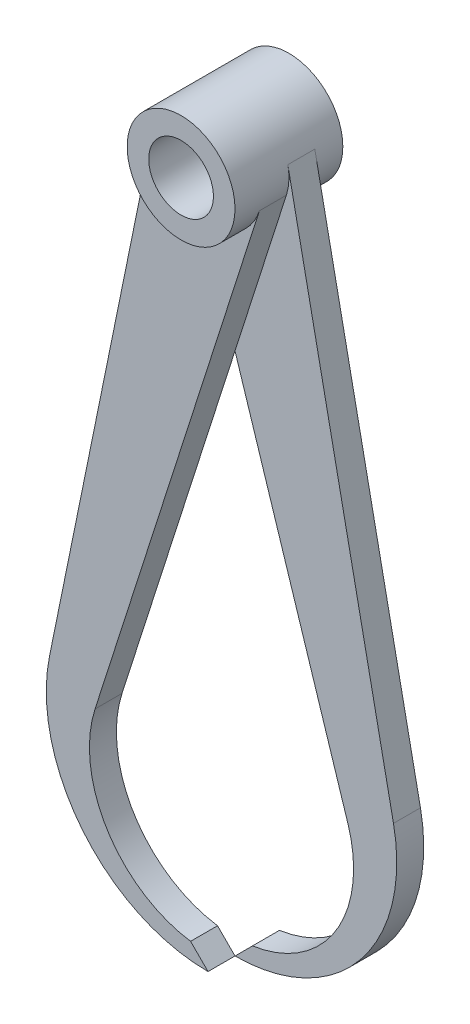
ISO-10303-21;
HEADER;
FILE_DESCRIPTION(('STEP AP214'),'2;1');
FILE_NAME('part.step','',(''),(''),'','','');
FILE_SCHEMA(('AUTOMOTIVE_DESIGN { 1 0 10303 214 1 1 1 1 }'));
ENDSEC;
DATA;
#1=APPLICATION_CONTEXT('core data for automotive mechanical design processes');
#2=APPLICATION_PROTOCOL_DEFINITION('international standard','automotive_design',2000,#1);
#3=PRODUCT_CONTEXT('',#1,'mechanical');
#4=PRODUCT('Part','Part','',(#3));
#5=PRODUCT_RELATED_PRODUCT_CATEGORY('part','',(#4));
#6=PRODUCT_DEFINITION_FORMATION('','',#4);
#7=PRODUCT_DEFINITION_CONTEXT('part definition',#1,'design');
#8=PRODUCT_DEFINITION('design','',#6,#7);
#9=PRODUCT_DEFINITION_SHAPE('','',#8);
#10=(LENGTH_UNIT() NAMED_UNIT(*) SI_UNIT(.MILLI.,.METRE.));
#11=(NAMED_UNIT(*) PLANE_ANGLE_UNIT() SI_UNIT($,.RADIAN.));
#12=(NAMED_UNIT(*) SI_UNIT($,.STERADIAN.) SOLID_ANGLE_UNIT());
#13=UNCERTAINTY_MEASURE_WITH_UNIT(LENGTH_MEASURE(1.E-05),#10,'distance_accuracy_value','');
#14=(GEOMETRIC_REPRESENTATION_CONTEXT(3) GLOBAL_UNCERTAINTY_ASSIGNED_CONTEXT((#13)) GLOBAL_UNIT_ASSIGNED_CONTEXT((#10,
#11,#12)) REPRESENTATION_CONTEXT('',''));
#15=CARTESIAN_POINT('',(0.,0.,0.));
#16=DIRECTION('',(0.,0.,1.));
#17=DIRECTION('',(1.,0.,0.));
#18=AXIS2_PLACEMENT_3D('',#15,#16,#17);
#19=CARTESIAN_POINT('',(0.,105.,-5.));
#20=DIRECTION('',(0.,0.,1.));
#21=DIRECTION('',(1.,0.,0.));
#22=AXIS2_PLACEMENT_3D('',#19,#20,#21);
#23=CYLINDRICAL_SURFACE('',#22,10.);
#24=CARTESIAN_POINT('',(0.,105.,0.));
#25=DIRECTION('',(0.,0.,1.));
#26=DIRECTION('',(1.,0.,0.));
#27=AXIS2_PLACEMENT_3D('',#24,#25,#26);
#28=CIRCLE('',#27,10.);
#29=CARTESIAN_POINT('',(-9.52428570238155,101.952380952381,0.));
#30=VERTEX_POINT('',#29);
#31=CARTESIAN_POINT('',(9.7979589711327,107.,0.));
#32=VERTEX_POINT('',#31);
#33=EDGE_CURVE('E127',#30,#32,#28,.T.);
#34=ORIENTED_EDGE('',*,*,#33,.T.);
#35=DIRECTION('',(0.,0.,1.));
#36=VECTOR('',#35,1.);
#37=CARTESIAN_POINT('',(9.7979589711327,107.,-5.));
#38=LINE('',#37,#36);
#39=CARTESIAN_POINT('',(9.7979589711327,107.,-5.));
#40=VERTEX_POINT('',#39);
#41=EDGE_CURVE('E12',#40,#32,#38,.T.);
#42=ORIENTED_EDGE('',*,*,#41,.F.);
#43=CARTESIAN_POINT('',(0.,105.,-5.));
#44=DIRECTION('',(0.,0.,1.));
#45=DIRECTION('',(1.,0.,0.));
#46=AXIS2_PLACEMENT_3D('',#43,#44,#45);
#47=CIRCLE('',#46,10.);
#48=CARTESIAN_POINT('',(-9.52428570238155,101.952380952381,-5.));
#49=VERTEX_POINT('',#48);
#50=EDGE_CURVE('E64',#49,#40,#47,.T.);
#51=ORIENTED_EDGE('',*,*,#50,.F.);
#52=DIRECTION('',(0.,0.,1.));
#53=VECTOR('',#52,1.);
#54=CARTESIAN_POINT('',(-9.52428570238155,101.952380952381,-5.));
#55=LINE('',#54,#53);
#56=EDGE_CURVE('E49',#49,#30,#55,.T.);
#57=ORIENTED_EDGE('',*,*,#56,.T.);
#58=EDGE_LOOP('',(#34,#42,#51,#57));
#59=FACE_BOUND('',#58,.T.);
#60=ADVANCED_FACE('F46',(#59),#23,.F.);
#61=CARTESIAN_POINT('',(30.3736728105114,6.2,-5.));
#62=DIRECTION('',(0.979795897113271,0.2,0.));
#63=DIRECTION('',(-0.2,0.979795897113271,0.));
#64=AXIS2_PLACEMENT_3D('',#61,#62,#63);
#65=PLANE('',#64);
#66=DIRECTION('',(-0.2,0.979795897113271,0.));
#67=VECTOR('',#66,1.);
#68=CARTESIAN_POINT('',(30.3736728105114,6.2,0.));
#69=LINE('',#68,#67);
#70=CARTESIAN_POINT('',(29.3938769133981,11.,0.));
#71=VERTEX_POINT('',#70);
#72=EDGE_CURVE('E136',#71,#32,#69,.T.);
#73=ORIENTED_EDGE('',*,*,#72,.F.);
#74=DIRECTION('',(0.,0.,1.));
#75=VECTOR('',#74,1.);
#76=CARTESIAN_POINT('',(29.3938769133981,11.,-5.));
#77=LINE('',#76,#75);
#78=CARTESIAN_POINT('',(29.3938769133981,11.,-5.));
#79=VERTEX_POINT('',#78);
#80=EDGE_CURVE('E55',#79,#71,#77,.T.);
#81=ORIENTED_EDGE('',*,*,#80,.F.);
#82=DIRECTION('',(-0.2,0.979795897113271,0.));
#83=VECTOR('',#82,1.);
#84=CARTESIAN_POINT('',(30.3736728105114,6.2,-5.));
#85=LINE('',#84,#83);
#86=EDGE_CURVE('E122',#79,#40,#85,.T.);
#87=ORIENTED_EDGE('',*,*,#86,.T.);
#88=ORIENTED_EDGE('',*,*,#41,.T.);
#89=EDGE_LOOP('',(#73,#81,#87,#88));
#90=FACE_BOUND('',#89,.T.);
#91=ADVANCED_FACE('F151',(#90),#65,.T.);
#92=CARTESIAN_POINT('',(0.,5.,-5.));
#93=DIRECTION('',(0.,0.,1.));
#94=DIRECTION('',(1.,0.,0.));
#95=AXIS2_PLACEMENT_3D('',#92,#93,#94);
#96=CYLINDRICAL_SURFACE('',#95,30.);
#97=CARTESIAN_POINT('',(0.,5.,0.));
#98=DIRECTION('',(0.,0.,1.));
#99=DIRECTION('',(1.,0.,0.));
#100=AXIS2_PLACEMENT_3D('',#97,#98,#99);
#101=CIRCLE('',#100,30.);
#102=CARTESIAN_POINT('',(0.,-25.,0.));
#103=VERTEX_POINT('',#102);
#104=EDGE_CURVE('E109',#103,#71,#101,.T.);
#105=ORIENTED_EDGE('',*,*,#104,.F.);
#106=DIRECTION('',(0.,0.,1.));
#107=VECTOR('',#106,1.);
#108=CARTESIAN_POINT('',(0.,-25.,-5.));
#109=LINE('',#108,#107);
#110=CARTESIAN_POINT('',(0.,-25.,-5.));
#111=VERTEX_POINT('',#110);
#112=EDGE_CURVE('E104',#111,#103,#109,.T.);
#113=ORIENTED_EDGE('',*,*,#112,.F.);
#114=CARTESIAN_POINT('',(0.,5.,-5.));
#115=DIRECTION('',(0.,0.,1.));
#116=DIRECTION('',(1.,0.,0.));
#117=AXIS2_PLACEMENT_3D('',#114,#115,#116);
#118=CIRCLE('',#117,30.);
#119=EDGE_CURVE('E108',#111,#79,#118,.T.);
#120=ORIENTED_EDGE('',*,*,#119,.T.);
#121=ORIENTED_EDGE('',*,*,#80,.T.);
#122=EDGE_LOOP('',(#105,#113,#120,#121));
#123=FACE_BOUND('',#122,.T.);
#124=ADVANCED_FACE('F106',(#123),#96,.T.);
#125=CARTESIAN_POINT('',(12.5,-12.5,-5.));
#126=DIRECTION('',(0.707106781186547,-0.707106781186548,0.));
#127=DIRECTION('',(0.707106781186548,0.707106781186547,0.));
#128=AXIS2_PLACEMENT_3D('',#125,#126,#127);
#129=PLANE('',#128);
#130=DIRECTION('',(0.707106781186548,0.707106781186547,0.));
#131=VECTOR('',#130,1.);
#132=CARTESIAN_POINT('',(12.5,-12.5,0.));
#133=LINE('',#132,#131);
#134=CARTESIAN_POINT('',(3.23987041127393,-21.7601295887261,0.));
#135=VERTEX_POINT('',#134);
#136=EDGE_CURVE('E133',#103,#135,#133,.T.);
#137=ORIENTED_EDGE('',*,*,#136,.T.);
#138=DIRECTION('',(0.,0.,1.));
#139=VECTOR('',#138,1.);
#140=CARTESIAN_POINT('',(3.23987041127393,-21.7601295887261,-5.));
#141=LINE('',#140,#139);
#142=CARTESIAN_POINT('',(3.23987041127393,-21.7601295887261,-5.));
#143=VERTEX_POINT('',#142);
#144=EDGE_CURVE('E112',#143,#135,#141,.T.);
#145=ORIENTED_EDGE('',*,*,#144,.F.);
#146=DIRECTION('',(0.707106781186548,0.707106781186547,0.));
#147=VECTOR('',#146,1.);
#148=CARTESIAN_POINT('',(12.5,-12.5,-5.));
#149=LINE('',#148,#147);
#150=EDGE_CURVE('E115',#111,#143,#149,.T.);
#151=ORIENTED_EDGE('',*,*,#150,.F.);
#152=ORIENTED_EDGE('',*,*,#112,.T.);
#153=EDGE_LOOP('',(#137,#145,#151,#152));
#154=FACE_BOUND('',#153,.T.);
#155=ADVANCED_FACE('F116',(#154),#129,.F.);
#156=CARTESIAN_POINT('',(0.,0.,-5.));
#157=DIRECTION('',(0.,0.,1.));
#158=DIRECTION('',(1.,0.,0.));
#159=AXIS2_PLACEMENT_3D('',#156,#157,#158);
#160=CYLINDRICAL_SURFACE('',#159,22.);
#161=CARTESIAN_POINT('',(0.,0.,0.));
#162=DIRECTION('',(0.,0.,1.));
#163=DIRECTION('',(1.,0.,0.));
#164=AXIS2_PLACEMENT_3D('',#161,#162,#163);
#165=CIRCLE('',#164,22.);
#166=CARTESIAN_POINT('',(20.9534285452394,6.7047619047619,0.));
#167=VERTEX_POINT('',#166);
#168=EDGE_CURVE('E131',#135,#167,#165,.T.);
#169=ORIENTED_EDGE('',*,*,#168,.T.);
#170=DIRECTION('',(0.,0.,1.));
#171=VECTOR('',#170,1.);
#172=CARTESIAN_POINT('',(20.9534285452394,6.7047619047619,-5.));
#173=LINE('',#172,#171);
#174=CARTESIAN_POINT('',(20.9534285452394,6.7047619047619,-5.));
#175=VERTEX_POINT('',#174);
#176=EDGE_CURVE('E140',#175,#167,#173,.T.);
#177=ORIENTED_EDGE('',*,*,#176,.F.);
#178=CARTESIAN_POINT('',(0.,0.,-5.));
#179=DIRECTION('',(0.,0.,1.));
#180=DIRECTION('',(1.,0.,0.));
#181=AXIS2_PLACEMENT_3D('',#178,#179,#180);
#182=CIRCLE('',#181,22.);
#183=EDGE_CURVE('E119',#143,#175,#182,.T.);
#184=ORIENTED_EDGE('',*,*,#183,.F.);
#185=ORIENTED_EDGE('',*,*,#144,.T.);
#186=EDGE_LOOP('',(#169,#177,#184,#185));
#187=FACE_BOUND('',#186,.T.);
#188=ADVANCED_FACE('F164',(#187),#160,.F.);
#189=CARTESIAN_POINT('',(20.9534285452394,6.7047619047619,-5.));
#190=DIRECTION('',(0.952428570238155,0.304761904761905,0.));
#191=DIRECTION('',(-0.304761904761905,0.952428570238155,0.));
#192=AXIS2_PLACEMENT_3D('',#189,#190,#191);
#193=PLANE('',#192);
#194=DIRECTION('',(-0.304761904761905,0.952428570238155,0.));
#195=VECTOR('',#194,1.);
#196=CARTESIAN_POINT('',(20.9534285452394,6.7047619047619,0.));
#197=LINE('',#196,#195);
#198=EDGE_CURVE('E129',#167,#30,#197,.T.);
#199=ORIENTED_EDGE('',*,*,#198,.T.);
#200=ORIENTED_EDGE('',*,*,#56,.F.);
#201=DIRECTION('',(-0.304761904761905,0.952428570238155,0.));
#202=VECTOR('',#201,1.);
#203=CARTESIAN_POINT('',(20.9534285452394,6.7047619047619,-5.));
#204=LINE('',#203,#202);
#205=EDGE_CURVE('E97',#175,#49,#204,.T.);
#206=ORIENTED_EDGE('',*,*,#205,.F.);
#207=ORIENTED_EDGE('',*,*,#176,.T.);
#208=EDGE_LOOP('',(#199,#200,#206,#207));
#209=FACE_BOUND('',#208,.T.);
#210=ADVANCED_FACE('F166',(#209),#193,.F.);
#211=CARTESIAN_POINT('',(0.,0.,-5.));
#212=DIRECTION('',(0.,0.,1.));
#213=DIRECTION('',(1.,0.,0.));
#214=AXIS2_PLACEMENT_3D('',#211,#212,#213);
#215=PLANE('',#214);
#216=ORIENTED_EDGE('',*,*,#50,.T.);
#217=ORIENTED_EDGE('',*,*,#86,.F.);
#218=ORIENTED_EDGE('',*,*,#119,.F.);
#219=ORIENTED_EDGE('',*,*,#150,.T.);
#220=ORIENTED_EDGE('',*,*,#183,.T.);
#221=ORIENTED_EDGE('',*,*,#205,.T.);
#222=EDGE_LOOP('',(#216,#217,#218,#219,#220,#221));
#223=FACE_BOUND('',#222,.T.);
#224=ADVANCED_FACE('F121',(#223),#215,.F.);
#225=CARTESIAN_POINT('',(0.,0.,0.));
#226=DIRECTION('',(0.,0.,1.));
#227=DIRECTION('',(1.,0.,0.));
#228=AXIS2_PLACEMENT_3D('',#225,#226,#227);
#229=PLANE('',#228);
#230=ORIENTED_EDGE('',*,*,#33,.F.);
#231=ORIENTED_EDGE('',*,*,#198,.F.);
#232=ORIENTED_EDGE('',*,*,#168,.F.);
#233=ORIENTED_EDGE('',*,*,#136,.F.);
#234=ORIENTED_EDGE('',*,*,#104,.T.);
#235=ORIENTED_EDGE('',*,*,#72,.T.);
#236=EDGE_LOOP('',(#230,#231,#232,#233,#234,#235));
#237=FACE_BOUND('',#236,.T.);
#238=ADVANCED_FACE('F149',(#237),#229,.T.);
#239=CLOSED_SHELL('',(#60,#91,#124,#155,#188,#210,#224,#238));
#240=MANIFOLD_SOLID_BREP('B2',#239);
#241=CARTESIAN_POINT('',(0.,105.,10.));
#242=DIRECTION('',(0.,0.,-1.));
#243=DIRECTION('',(-1.,0.,0.));
#244=AXIS2_PLACEMENT_3D('',#241,#242,#243);
#245=CYLINDRICAL_SURFACE('',#244,6.);
#246=CARTESIAN_POINT('',(0.,105.,10.));
#247=DIRECTION('',(0.,0.,1.));
#248=DIRECTION('',(1.,0.,0.));
#249=AXIS2_PLACEMENT_3D('',#246,#247,#248);
#250=CIRCLE('',#249,6.);
#251=CARTESIAN_POINT('',(6.,105.,10.));
#252=VERTEX_POINT('',#251);
#253=EDGE_CURVE('E257',#252,#252,#250,.T.);
#254=ORIENTED_EDGE('',*,*,#253,.T.);
#255=EDGE_LOOP('',(#254));
#256=FACE_BOUND('',#255,.T.);
#257=CARTESIAN_POINT('',(0.,105.,-10.));
#258=DIRECTION('',(0.,0.,1.));
#259=DIRECTION('',(1.,0.,0.));
#260=AXIS2_PLACEMENT_3D('',#257,#258,#259);
#261=CIRCLE('',#260,6.);
#262=CARTESIAN_POINT('',(6.,105.,-10.));
#263=VERTEX_POINT('',#262);
#264=EDGE_CURVE('E353',#263,#263,#261,.T.);
#265=ORIENTED_EDGE('',*,*,#264,.F.);
#266=EDGE_LOOP('',(#265));
#267=FACE_BOUND('',#266,.T.);
#268=ADVANCED_FACE('F249',(#256,#267),#245,.F.);
#269=CARTESIAN_POINT('',(0.,105.,10.));
#270=DIRECTION('',(0.,0.,-1.));
#271=DIRECTION('',(-1.,0.,0.));
#272=AXIS2_PLACEMENT_3D('',#269,#270,#271);
#273=CYLINDRICAL_SURFACE('',#272,10.);
#274=DIRECTION('',(0.,0.,-1.));
#275=VECTOR('',#274,1.);
#276=CARTESIAN_POINT('',(-9.7979589711327,107.,5.));
#277=LINE('',#276,#275);
#278=CARTESIAN_POINT('',(-9.79795897113271,107.,5.));
#279=VERTEX_POINT('',#278);
#280=CARTESIAN_POINT('',(-9.79795897113271,107.,0.));
#281=VERTEX_POINT('',#280);
#282=EDGE_CURVE('E270',#279,#281,#277,.T.);
#283=ORIENTED_EDGE('',*,*,#282,.F.);
#284=CARTESIAN_POINT('',(0.,105.,5.));
#285=DIRECTION('',(0.,0.,1.));
#286=DIRECTION('',(1.,0.,0.));
#287=AXIS2_PLACEMENT_3D('',#284,#285,#286);
#288=CIRCLE('',#287,10.);
#289=CARTESIAN_POINT('',(9.52428570238154,101.952380952381,5.));
#290=VERTEX_POINT('',#289);
#291=EDGE_CURVE('E265',#279,#290,#288,.T.);
#292=ORIENTED_EDGE('',*,*,#291,.T.);
#293=DIRECTION('',(0.,0.,-1.));
#294=VECTOR('',#293,1.);
#295=CARTESIAN_POINT('',(9.52428570238154,101.952380952381,5.));
#296=LINE('',#295,#294);
#297=CARTESIAN_POINT('',(9.52428570238154,101.952380952381,0.));
#298=VERTEX_POINT('',#297);
#299=EDGE_CURVE('E351',#290,#298,#296,.T.);
#300=ORIENTED_EDGE('',*,*,#299,.T.);
#301=CARTESIAN_POINT('',(0.,105.,0.));
#302=DIRECTION('',(0.,0.,1.));
#303=DIRECTION('',(1.,0.,0.));
#304=AXIS2_PLACEMENT_3D('',#301,#302,#303);
#305=CIRCLE('',#304,10.);
#306=EDGE_CURVE('E334',#281,#298,#305,.T.);
#307=ORIENTED_EDGE('',*,*,#306,.F.);
#308=EDGE_LOOP('',(#283,#292,#300,#307));
#309=FACE_BOUND('',#308,.T.);
#310=CARTESIAN_POINT('',(0.,105.,10.));
#311=DIRECTION('',(0.,0.,1.));
#312=DIRECTION('',(1.,0.,0.));
#313=AXIS2_PLACEMENT_3D('',#310,#311,#312);
#314=CIRCLE('',#313,10.);
#315=CARTESIAN_POINT('',(10.,105.,10.));
#316=VERTEX_POINT('',#315);
#317=EDGE_CURVE('E44',#316,#316,#314,.T.);
#318=ORIENTED_EDGE('',*,*,#317,.F.);
#319=EDGE_LOOP('',(#318));
#320=FACE_BOUND('',#319,.T.);
#321=CARTESIAN_POINT('',(0.,105.,-10.));
#322=DIRECTION('',(0.,0.,1.));
#323=DIRECTION('',(1.,0.,0.));
#324=AXIS2_PLACEMENT_3D('',#321,#322,#323);
#325=CIRCLE('',#324,10.);
#326=CARTESIAN_POINT('',(10.,105.,-10.));
#327=VERTEX_POINT('',#326);
#328=EDGE_CURVE('E252',#327,#327,#325,.T.);
#329=ORIENTED_EDGE('',*,*,#328,.T.);
#330=EDGE_LOOP('',(#329));
#331=FACE_BOUND('',#330,.T.);
#332=ADVANCED_FACE('F361',(#309,#320,#331),#273,.T.);
#333=CARTESIAN_POINT('',(0.,0.,10.));
#334=DIRECTION('',(0.,0.,1.));
#335=DIRECTION('',(1.,0.,0.));
#336=AXIS2_PLACEMENT_3D('',#333,#334,#335);
#337=PLANE('',#336);
#338=ORIENTED_EDGE('',*,*,#253,.F.);
#339=EDGE_LOOP('',(#338));
#340=FACE_BOUND('',#339,.T.);
#341=ORIENTED_EDGE('',*,*,#317,.T.);
#342=EDGE_LOOP('',(#341));
#343=FACE_BOUND('',#342,.T.);
#344=ADVANCED_FACE('F366',(#340,#343),#337,.T.);
#345=CARTESIAN_POINT('',(0.,0.,-10.));
#346=DIRECTION('',(0.,0.,1.));
#347=DIRECTION('',(1.,0.,0.));
#348=AXIS2_PLACEMENT_3D('',#345,#346,#347);
#349=PLANE('',#348);
#350=ORIENTED_EDGE('',*,*,#264,.T.);
#351=EDGE_LOOP('',(#350));
#352=FACE_BOUND('',#351,.T.);
#353=ORIENTED_EDGE('',*,*,#328,.F.);
#354=EDGE_LOOP('',(#353));
#355=FACE_BOUND('',#354,.T.);
#356=ADVANCED_FACE('F363',(#352,#355),#349,.F.);
#357=CARTESIAN_POINT('',(-20.9534285452394,6.7047619047619,5.));
#358=DIRECTION('',(-0.952428570238155,0.304761904761905,0.));
#359=DIRECTION('',(-0.304761904761905,-0.952428570238155,0.));
#360=AXIS2_PLACEMENT_3D('',#357,#358,#359);
#361=PLANE('',#360);
#362=DIRECTION('',(0.304761904761905,0.952428570238155,0.));
#363=VECTOR('',#362,1.);
#364=CARTESIAN_POINT('',(-20.9534285452394,6.7047619047619,0.));
#365=LINE('',#364,#363);
#366=CARTESIAN_POINT('',(-20.9534285452394,6.7047619047619,0.));
#367=VERTEX_POINT('',#366);
#368=EDGE_CURVE('E331',#367,#298,#365,.T.);
#369=ORIENTED_EDGE('',*,*,#368,.T.);
#370=ORIENTED_EDGE('',*,*,#299,.F.);
#371=DIRECTION('',(0.304761904761905,0.952428570238155,0.));
#372=VECTOR('',#371,1.);
#373=CARTESIAN_POINT('',(-20.9534285452394,6.7047619047619,5.));
#374=LINE('',#373,#372);
#375=CARTESIAN_POINT('',(-20.9534285452394,6.7047619047619,5.));
#376=VERTEX_POINT('',#375);
#377=EDGE_CURVE('E322',#376,#290,#374,.T.);
#378=ORIENTED_EDGE('',*,*,#377,.F.);
#379=DIRECTION('',(0.,0.,-1.));
#380=VECTOR('',#379,1.);
#381=CARTESIAN_POINT('',(-20.9534285452394,6.7047619047619,5.));
#382=LINE('',#381,#380);
#383=EDGE_CURVE('E330',#376,#367,#382,.T.);
#384=ORIENTED_EDGE('',*,*,#383,.T.);
#385=EDGE_LOOP('',(#369,#370,#378,#384));
#386=FACE_BOUND('',#385,.T.);
#387=ADVANCED_FACE('F365',(#386),#361,.F.);
#388=CARTESIAN_POINT('',(-30.3736728105114,6.2,5.));
#389=DIRECTION('',(-0.979795897113271,0.2,0.));
#390=DIRECTION('',(-0.2,-0.979795897113271,0.));
#391=AXIS2_PLACEMENT_3D('',#388,#389,#390);
#392=PLANE('',#391);
#393=DIRECTION('',(0.2,0.979795897113271,0.));
#394=VECTOR('',#393,1.);
#395=CARTESIAN_POINT('',(-30.3736728105114,6.2,0.));
#396=LINE('',#395,#394);
#397=CARTESIAN_POINT('',(-29.3938769133981,11.,0.));
#398=VERTEX_POINT('',#397);
#399=EDGE_CURVE('E307',#398,#281,#396,.T.);
#400=ORIENTED_EDGE('',*,*,#399,.F.);
#401=DIRECTION('',(0.,0.,-1.));
#402=VECTOR('',#401,1.);
#403=CARTESIAN_POINT('',(-29.3938769133981,11.,5.));
#404=LINE('',#403,#402);
#405=CARTESIAN_POINT('',(-29.3938769133981,11.,5.));
#406=VERTEX_POINT('',#405);
#407=EDGE_CURVE('E301',#406,#398,#404,.T.);
#408=ORIENTED_EDGE('',*,*,#407,.F.);
#409=DIRECTION('',(0.2,0.979795897113271,0.));
#410=VECTOR('',#409,1.);
#411=CARTESIAN_POINT('',(-30.3736728105114,6.2,5.));
#412=LINE('',#411,#410);
#413=EDGE_CURVE('E305',#406,#279,#412,.T.);
#414=ORIENTED_EDGE('',*,*,#413,.T.);
#415=ORIENTED_EDGE('',*,*,#282,.T.);
#416=EDGE_LOOP('',(#400,#408,#414,#415));
#417=FACE_BOUND('',#416,.T.);
#418=ADVANCED_FACE('F303',(#417),#392,.T.);
#419=CARTESIAN_POINT('',(0.,5.,5.));
#420=DIRECTION('',(0.,0.,-1.));
#421=DIRECTION('',(-1.,0.,0.));
#422=AXIS2_PLACEMENT_3D('',#419,#420,#421);
#423=CYLINDRICAL_SURFACE('',#422,30.);
#424=CARTESIAN_POINT('',(0.,5.,0.));
#425=DIRECTION('',(0.,0.,1.));
#426=DIRECTION('',(1.,0.,0.));
#427=AXIS2_PLACEMENT_3D('',#424,#425,#426);
#428=CIRCLE('',#427,30.);
#429=CARTESIAN_POINT('',(0.,-25.,0.));
#430=VERTEX_POINT('',#429);
#431=EDGE_CURVE('E338',#398,#430,#428,.T.);
#432=ORIENTED_EDGE('',*,*,#431,.T.);
#433=DIRECTION('',(0.,0.,-1.));
#434=VECTOR('',#433,1.);
#435=CARTESIAN_POINT('',(0.,-25.,5.));
#436=LINE('',#435,#434);
#437=CARTESIAN_POINT('',(0.,-25.,5.));
#438=VERTEX_POINT('',#437);
#439=EDGE_CURVE('E310',#438,#430,#436,.T.);
#440=ORIENTED_EDGE('',*,*,#439,.F.);
#441=CARTESIAN_POINT('',(0.,5.,5.));
#442=DIRECTION('',(0.,0.,1.));
#443=DIRECTION('',(1.,0.,0.));
#444=AXIS2_PLACEMENT_3D('',#441,#442,#443);
#445=CIRCLE('',#444,30.);
#446=EDGE_CURVE('E313',#406,#438,#445,.T.);
#447=ORIENTED_EDGE('',*,*,#446,.F.);
#448=ORIENTED_EDGE('',*,*,#407,.T.);
#449=EDGE_LOOP('',(#432,#440,#447,#448));
#450=FACE_BOUND('',#449,.T.);
#451=ADVANCED_FACE('F314',(#450),#423,.T.);
#452=CARTESIAN_POINT('',(-12.5,-12.5,5.));
#453=DIRECTION('',(-0.707106781186547,-0.707106781186548,0.));
#454=DIRECTION('',(0.707106781186548,-0.707106781186547,0.));
#455=AXIS2_PLACEMENT_3D('',#452,#453,#454);
#456=PLANE('',#455);
#457=DIRECTION('',(-0.707106781186548,0.707106781186547,0.));
#458=VECTOR('',#457,1.);
#459=CARTESIAN_POINT('',(-12.5,-12.5,0.));
#460=LINE('',#459,#458);
#461=CARTESIAN_POINT('',(-3.23987041127393,-21.7601295887261,0.));
#462=VERTEX_POINT('',#461);
#463=EDGE_CURVE('E340',#430,#462,#460,.T.);
#464=ORIENTED_EDGE('',*,*,#463,.T.);
#465=DIRECTION('',(0.,0.,-1.));
#466=VECTOR('',#465,1.);
#467=CARTESIAN_POINT('',(-3.23987041127393,-21.7601295887261,5.));
#468=LINE('',#467,#466);
#469=CARTESIAN_POINT('',(-3.23987041127393,-21.7601295887261,5.));
#470=VERTEX_POINT('',#469);
#471=EDGE_CURVE('E347',#470,#462,#468,.T.);
#472=ORIENTED_EDGE('',*,*,#471,.F.);
#473=DIRECTION('',(-0.707106781186548,0.707106781186547,0.));
#474=VECTOR('',#473,1.);
#475=CARTESIAN_POINT('',(-12.5,-12.5,5.));
#476=LINE('',#475,#474);
#477=EDGE_CURVE('E318',#438,#470,#476,.T.);
#478=ORIENTED_EDGE('',*,*,#477,.F.);
#479=ORIENTED_EDGE('',*,*,#439,.T.);
#480=EDGE_LOOP('',(#464,#472,#478,#479));
#481=FACE_BOUND('',#480,.T.);
#482=ADVANCED_FACE('F428',(#481),#456,.F.);
#483=CARTESIAN_POINT('',(0.,0.,5.));
#484=DIRECTION('',(0.,0.,-1.));
#485=DIRECTION('',(-1.,0.,0.));
#486=AXIS2_PLACEMENT_3D('',#483,#484,#485);
#487=CYLINDRICAL_SURFACE('',#486,22.);
#488=CARTESIAN_POINT('',(0.,0.,0.));
#489=DIRECTION('',(0.,0.,1.));
#490=DIRECTION('',(1.,0.,0.));
#491=AXIS2_PLACEMENT_3D('',#488,#489,#490);
#492=CIRCLE('',#491,22.);
#493=EDGE_CURVE('E343',#367,#462,#492,.T.);
#494=ORIENTED_EDGE('',*,*,#493,.F.);
#495=ORIENTED_EDGE('',*,*,#383,.F.);
#496=CARTESIAN_POINT('',(0.,0.,5.));
#497=DIRECTION('',(0.,0.,1.));
#498=DIRECTION('',(1.,0.,0.));
#499=AXIS2_PLACEMENT_3D('',#496,#497,#498);
#500=CIRCLE('',#499,22.);
#501=EDGE_CURVE('E327',#376,#470,#500,.T.);
#502=ORIENTED_EDGE('',*,*,#501,.T.);
#503=ORIENTED_EDGE('',*,*,#471,.T.);
#504=EDGE_LOOP('',(#494,#495,#502,#503));
#505=FACE_BOUND('',#504,.T.);
#506=ADVANCED_FACE('F438',(#505),#487,.F.);
#507=CARTESIAN_POINT('',(0.,0.,5.));
#508=DIRECTION('',(0.,0.,1.));
#509=DIRECTION('',(1.,0.,0.));
#510=AXIS2_PLACEMENT_3D('',#507,#508,#509);
#511=PLANE('',#510);
#512=ORIENTED_EDGE('',*,*,#377,.T.);
#513=ORIENTED_EDGE('',*,*,#291,.F.);
#514=ORIENTED_EDGE('',*,*,#413,.F.);
#515=ORIENTED_EDGE('',*,*,#446,.T.);
#516=ORIENTED_EDGE('',*,*,#477,.T.);
#517=ORIENTED_EDGE('',*,*,#501,.F.);
#518=EDGE_LOOP('',(#512,#513,#514,#515,#516,#517));
#519=FACE_BOUND('',#518,.T.);
#520=ADVANCED_FACE('F320',(#519),#511,.T.);
#521=CARTESIAN_POINT('',(0.,0.,0.));
#522=DIRECTION('',(0.,0.,1.));
#523=DIRECTION('',(1.,0.,0.));
#524=AXIS2_PLACEMENT_3D('',#521,#522,#523);
#525=PLANE('',#524);
#526=ORIENTED_EDGE('',*,*,#368,.F.);
#527=ORIENTED_EDGE('',*,*,#493,.T.);
#528=ORIENTED_EDGE('',*,*,#463,.F.);
#529=ORIENTED_EDGE('',*,*,#431,.F.);
#530=ORIENTED_EDGE('',*,*,#399,.T.);
#531=ORIENTED_EDGE('',*,*,#306,.T.);
#532=EDGE_LOOP('',(#526,#527,#528,#529,#530,#531));
#533=FACE_BOUND('',#532,.T.);
#534=ADVANCED_FACE('F459',(#533),#525,.F.);
#535=CLOSED_SHELL('',(#268,#332,#344,#356,#387,#418,#451,#482,#506,#520,#534));
#536=MANIFOLD_SOLID_BREP('B6',#535);
#537=ADVANCED_BREP_SHAPE_REPRESENTATION('',(#18,#240,#536),#14);
#538=SHAPE_DEFINITION_REPRESENTATION(#9,#537);
ENDSEC;
END-ISO-10303-21;
